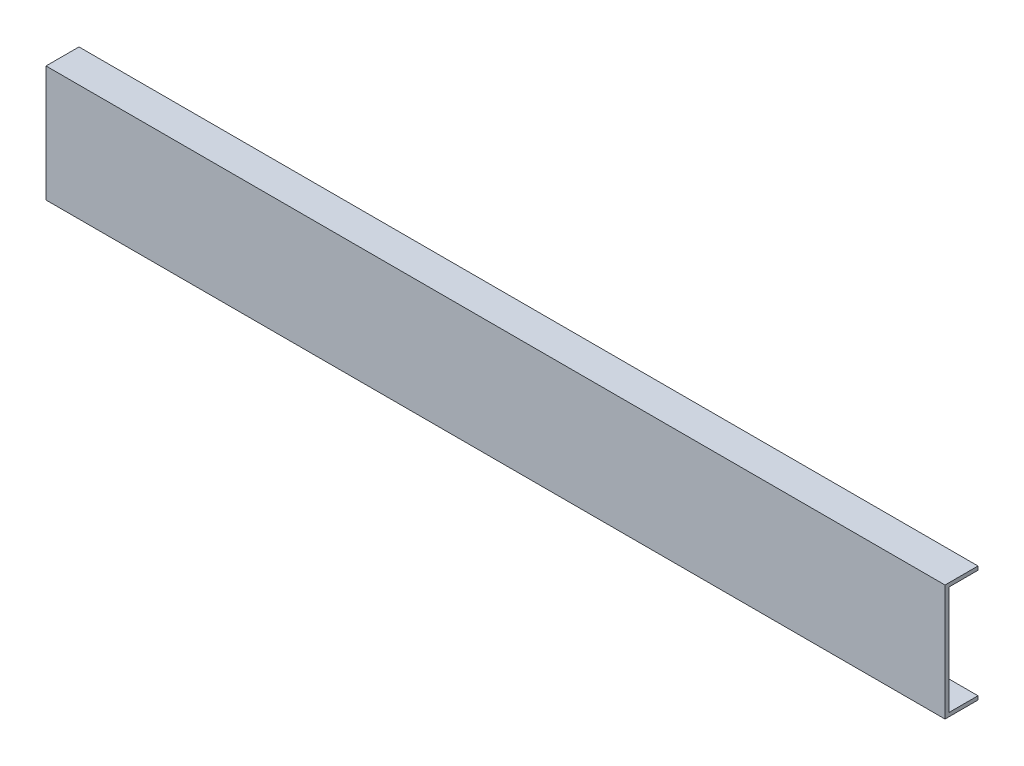
ISO-10303-21;
HEADER;
FILE_DESCRIPTION(('STEP AP214'),'2;1');
FILE_NAME('part.step','',(''),(''),'','','');
FILE_SCHEMA(('AUTOMOTIVE_DESIGN { 1 0 10303 214 1 1 1 1 }'));
ENDSEC;
DATA;
#1=APPLICATION_CONTEXT('core data for automotive mechanical design processes');
#2=APPLICATION_PROTOCOL_DEFINITION('international standard','automotive_design',2000,#1);
#3=PRODUCT_CONTEXT('',#1,'mechanical');
#4=PRODUCT('Part','Part','',(#3));
#5=PRODUCT_RELATED_PRODUCT_CATEGORY('part','',(#4));
#6=PRODUCT_DEFINITION_FORMATION('','',#4);
#7=PRODUCT_DEFINITION_CONTEXT('part definition',#1,'design');
#8=PRODUCT_DEFINITION('design','',#6,#7);
#9=PRODUCT_DEFINITION_SHAPE('','',#8);
#10=(LENGTH_UNIT() NAMED_UNIT(*) SI_UNIT(.MILLI.,.METRE.));
#11=(NAMED_UNIT(*) PLANE_ANGLE_UNIT() SI_UNIT($,.RADIAN.));
#12=(NAMED_UNIT(*) SI_UNIT($,.STERADIAN.) SOLID_ANGLE_UNIT());
#13=UNCERTAINTY_MEASURE_WITH_UNIT(LENGTH_MEASURE(1.E-05),#10,'distance_accuracy_value','');
#14=(GEOMETRIC_REPRESENTATION_CONTEXT(3) GLOBAL_UNCERTAINTY_ASSIGNED_CONTEXT((#13)) GLOBAL_UNIT_ASSIGNED_CONTEXT((#10,
#11,#12)) REPRESENTATION_CONTEXT('',''));
#15=CARTESIAN_POINT('',(0.,0.,0.));
#16=DIRECTION('',(0.,0.,1.));
#17=DIRECTION('',(1.,0.,0.));
#18=AXIS2_PLACEMENT_3D('',#15,#16,#17);
#19=CARTESIAN_POINT('',(0.,0.,0.));
#20=DIRECTION('',(0.,0.,-1.));
#21=DIRECTION('',(-1.,0.,0.));
#22=AXIS2_PLACEMENT_3D('',#19,#20,#21);
#23=PLANE('',#22);
#24=DIRECTION('',(1.,0.,0.));
#25=VECTOR('',#24,1.);
#26=CARTESIAN_POINT('',(0.,2.54,0.));
#27=LINE('',#26,#25);
#28=CARTESIAN_POINT('',(0.,2.54,0.));
#29=VERTEX_POINT('',#28);
#30=CARTESIAN_POINT('',(609.6,2.54,0.));
#31=VERTEX_POINT('',#30);
#32=EDGE_CURVE('E149',#29,#31,#27,.T.);
#33=ORIENTED_EDGE('',*,*,#32,.T.);
#34=DIRECTION('',(0.,1.,0.));
#35=VECTOR('',#34,1.);
#36=CARTESIAN_POINT('',(609.6,0.,0.));
#37=LINE('',#36,#35);
#38=CARTESIAN_POINT('',(609.6,0.,0.));
#39=VERTEX_POINT('',#38);
#40=EDGE_CURVE('E175',#39,#31,#37,.T.);
#41=ORIENTED_EDGE('',*,*,#40,.F.);
#42=DIRECTION('',(1.,0.,0.));
#43=VECTOR('',#42,1.);
#44=CARTESIAN_POINT('',(0.,0.,0.));
#45=LINE('',#44,#43);
#46=CARTESIAN_POINT('',(0.,0.,0.));
#47=VERTEX_POINT('',#46);
#48=EDGE_CURVE('E171',#47,#39,#45,.T.);
#49=ORIENTED_EDGE('',*,*,#48,.F.);
#50=DIRECTION('',(0.,-1.,0.));
#51=VECTOR('',#50,1.);
#52=CARTESIAN_POINT('',(0.,0.,0.));
#53=LINE('',#52,#51);
#54=EDGE_CURVE('E153',#29,#47,#53,.T.);
#55=ORIENTED_EDGE('',*,*,#54,.F.);
#56=EDGE_LOOP('',(#33,#41,#49,#55));
#57=FACE_BOUND('',#56,.T.);
#58=ADVANCED_FACE('F39',(#57),#23,.T.);
#59=CARTESIAN_POINT('',(0.,0.,22.352));
#60=DIRECTION('',(1.,0.,0.));
#61=DIRECTION('',(0.,0.,-1.));
#62=AXIS2_PLACEMENT_3D('',#59,#60,#61);
#63=PLANE('',#62);
#64=DIRECTION('',(0.,-1.,0.));
#65=VECTOR('',#64,1.);
#66=CARTESIAN_POINT('',(0.,76.2,19.812));
#67=LINE('',#66,#65);
#68=CARTESIAN_POINT('',(0.,76.2,19.812));
#69=VERTEX_POINT('',#68);
#70=CARTESIAN_POINT('',(0.,2.54,19.812));
#71=VERTEX_POINT('',#70);
#72=EDGE_CURVE('E125',#69,#71,#67,.T.);
#73=ORIENTED_EDGE('',*,*,#72,.T.);
#74=DIRECTION('',(0.,0.,-1.));
#75=VECTOR('',#74,1.);
#76=CARTESIAN_POINT('',(0.,2.54,0.));
#77=LINE('',#76,#75);
#78=EDGE_CURVE('E131',#71,#29,#77,.T.);
#79=ORIENTED_EDGE('',*,*,#78,.T.);
#80=ORIENTED_EDGE('',*,*,#54,.T.);
#81=DIRECTION('',(0.,0.,-1.));
#82=VECTOR('',#81,1.);
#83=CARTESIAN_POINT('',(0.,0.,22.352));
#84=LINE('',#83,#82);
#85=CARTESIAN_POINT('',(0.,0.,22.352));
#86=VERTEX_POINT('',#85);
#87=EDGE_CURVE('E11',#86,#47,#84,.T.);
#88=ORIENTED_EDGE('',*,*,#87,.F.);
#89=DIRECTION('',(0.,-1.,0.));
#90=VECTOR('',#89,1.);
#91=CARTESIAN_POINT('',(0.,0.,22.352));
#92=LINE('',#91,#90);
#93=CARTESIAN_POINT('',(0.,78.74,22.352));
#94=VERTEX_POINT('',#93);
#95=EDGE_CURVE('E158',#94,#86,#92,.T.);
#96=ORIENTED_EDGE('',*,*,#95,.F.);
#97=DIRECTION('',(0.,0.,-1.));
#98=VECTOR('',#97,1.);
#99=CARTESIAN_POINT('',(0.,78.74,22.352));
#100=LINE('',#99,#98);
#101=CARTESIAN_POINT('',(0.,78.74,0.));
#102=VERTEX_POINT('',#101);
#103=EDGE_CURVE('E168',#94,#102,#100,.T.);
#104=ORIENTED_EDGE('',*,*,#103,.T.);
#105=CARTESIAN_POINT('',(0.,76.2,0.));
#106=VERTEX_POINT('',#105);
#107=EDGE_CURVE('E135',#102,#106,#53,.T.);
#108=ORIENTED_EDGE('',*,*,#107,.T.);
#109=DIRECTION('',(0.,0.,1.));
#110=VECTOR('',#109,1.);
#111=CARTESIAN_POINT('',(0.,76.2,0.));
#112=LINE('',#111,#110);
#113=EDGE_CURVE('E55',#106,#69,#112,.T.);
#114=ORIENTED_EDGE('',*,*,#113,.T.);
#115=EDGE_LOOP('',(#73,#79,#80,#88,#96,#104,#108,#114));
#116=FACE_BOUND('',#115,.T.);
#117=ADVANCED_FACE('F41',(#116),#63,.F.);
#118=CARTESIAN_POINT('',(0.,0.,22.352));
#119=DIRECTION('',(0.,1.,0.));
#120=DIRECTION('',(0.,0.,1.));
#121=AXIS2_PLACEMENT_3D('',#118,#119,#120);
#122=PLANE('',#121);
#123=ORIENTED_EDGE('',*,*,#48,.T.);
#124=DIRECTION('',(0.,0.,-1.));
#125=VECTOR('',#124,1.);
#126=CARTESIAN_POINT('',(609.6,0.,22.352));
#127=LINE('',#126,#125);
#128=CARTESIAN_POINT('',(609.6,0.,22.352));
#129=VERTEX_POINT('',#128);
#130=EDGE_CURVE('E48',#129,#39,#127,.T.);
#131=ORIENTED_EDGE('',*,*,#130,.F.);
#132=DIRECTION('',(1.,0.,0.));
#133=VECTOR('',#132,1.);
#134=CARTESIAN_POINT('',(0.,0.,22.352));
#135=LINE('',#134,#133);
#136=EDGE_CURVE('E92',#86,#129,#135,.T.);
#137=ORIENTED_EDGE('',*,*,#136,.F.);
#138=ORIENTED_EDGE('',*,*,#87,.T.);
#139=EDGE_LOOP('',(#123,#131,#137,#138));
#140=FACE_BOUND('',#139,.T.);
#141=ADVANCED_FACE('F220',(#140),#122,.F.);
#142=CARTESIAN_POINT('',(609.6,0.,22.352));
#143=DIRECTION('',(-1.,0.,0.));
#144=DIRECTION('',(0.,0.,1.));
#145=AXIS2_PLACEMENT_3D('',#142,#143,#144);
#146=PLANE('',#145);
#147=ORIENTED_EDGE('',*,*,#40,.T.);
#148=DIRECTION('',(0.,0.,-1.));
#149=VECTOR('',#148,1.);
#150=CARTESIAN_POINT('',(609.6,2.54,0.));
#151=LINE('',#150,#149);
#152=CARTESIAN_POINT('',(609.6,2.54,19.812));
#153=VERTEX_POINT('',#152);
#154=EDGE_CURVE('E137',#153,#31,#151,.T.);
#155=ORIENTED_EDGE('',*,*,#154,.F.);
#156=DIRECTION('',(0.,-1.,0.));
#157=VECTOR('',#156,1.);
#158=CARTESIAN_POINT('',(609.6,76.2,19.812));
#159=LINE('',#158,#157);
#160=CARTESIAN_POINT('',(609.6,76.2,19.812));
#161=VERTEX_POINT('',#160);
#162=EDGE_CURVE('E140',#161,#153,#159,.T.);
#163=ORIENTED_EDGE('',*,*,#162,.F.);
#164=DIRECTION('',(0.,0.,1.));
#165=VECTOR('',#164,1.);
#166=CARTESIAN_POINT('',(609.6,76.2,0.));
#167=LINE('',#166,#165);
#168=CARTESIAN_POINT('',(609.6,76.2,0.));
#169=VERTEX_POINT('',#168);
#170=EDGE_CURVE('E116',#169,#161,#167,.T.);
#171=ORIENTED_EDGE('',*,*,#170,.F.);
#172=CARTESIAN_POINT('',(609.6,78.74,0.));
#173=VERTEX_POINT('',#172);
#174=EDGE_CURVE('E174',#169,#173,#37,.T.);
#175=ORIENTED_EDGE('',*,*,#174,.T.);
#176=DIRECTION('',(0.,0.,-1.));
#177=VECTOR('',#176,1.);
#178=CARTESIAN_POINT('',(609.6,78.74,22.352));
#179=LINE('',#178,#177);
#180=CARTESIAN_POINT('',(609.6,78.74,22.352));
#181=VERTEX_POINT('',#180);
#182=EDGE_CURVE('E183',#181,#173,#179,.T.);
#183=ORIENTED_EDGE('',*,*,#182,.F.);
#184=DIRECTION('',(0.,1.,0.));
#185=VECTOR('',#184,1.);
#186=CARTESIAN_POINT('',(609.6,0.,22.352));
#187=LINE('',#186,#185);
#188=EDGE_CURVE('E163',#129,#181,#187,.T.);
#189=ORIENTED_EDGE('',*,*,#188,.F.);
#190=ORIENTED_EDGE('',*,*,#130,.T.);
#191=EDGE_LOOP('',(#147,#155,#163,#171,#175,#183,#189,#190));
#192=FACE_BOUND('',#191,.T.);
#193=ADVANCED_FACE('F190',(#192),#146,.F.);
#194=CARTESIAN_POINT('',(0.,78.74,22.352));
#195=DIRECTION('',(0.,-1.,0.));
#196=DIRECTION('',(0.,0.,-1.));
#197=AXIS2_PLACEMENT_3D('',#194,#195,#196);
#198=PLANE('',#197);
#199=DIRECTION('',(-1.,0.,0.));
#200=VECTOR('',#199,1.);
#201=CARTESIAN_POINT('',(0.,78.74,0.));
#202=LINE('',#201,#200);
#203=EDGE_CURVE('E85',#173,#102,#202,.T.);
#204=ORIENTED_EDGE('',*,*,#203,.T.);
#205=ORIENTED_EDGE('',*,*,#103,.F.);
#206=DIRECTION('',(-1.,0.,0.));
#207=VECTOR('',#206,1.);
#208=CARTESIAN_POINT('',(0.,78.74,22.352));
#209=LINE('',#208,#207);
#210=EDGE_CURVE('E64',#181,#94,#209,.T.);
#211=ORIENTED_EDGE('',*,*,#210,.F.);
#212=ORIENTED_EDGE('',*,*,#182,.T.);
#213=EDGE_LOOP('',(#204,#205,#211,#212));
#214=FACE_BOUND('',#213,.T.);
#215=ADVANCED_FACE('F204',(#214),#198,.F.);
#216=CARTESIAN_POINT('',(0.,0.,22.352));
#217=DIRECTION('',(0.,0.,-1.));
#218=DIRECTION('',(-1.,0.,0.));
#219=AXIS2_PLACEMENT_3D('',#216,#217,#218);
#220=PLANE('',#219);
#221=ORIENTED_EDGE('',*,*,#95,.T.);
#222=ORIENTED_EDGE('',*,*,#136,.T.);
#223=ORIENTED_EDGE('',*,*,#188,.T.);
#224=ORIENTED_EDGE('',*,*,#210,.T.);
#225=EDGE_LOOP('',(#221,#222,#223,#224));
#226=FACE_BOUND('',#225,.T.);
#227=ADVANCED_FACE('F207',(#226),#220,.F.);
#228=DIRECTION('',(1.,0.,0.));
#229=VECTOR('',#228,1.);
#230=CARTESIAN_POINT('',(0.,76.2,0.));
#231=LINE('',#230,#229);
#232=EDGE_CURVE('E122',#106,#169,#231,.T.);
#233=ORIENTED_EDGE('',*,*,#232,.F.);
#234=ORIENTED_EDGE('',*,*,#107,.F.);
#235=ORIENTED_EDGE('',*,*,#203,.F.);
#236=ORIENTED_EDGE('',*,*,#174,.F.);
#237=EDGE_LOOP('',(#233,#234,#235,#236));
#238=FACE_BOUND('',#237,.T.);
#239=ADVANCED_FACE('F205',(#238),#23,.T.);
#240=CARTESIAN_POINT('',(0.,2.54,0.));
#241=DIRECTION('',(0.,-1.,0.));
#242=DIRECTION('',(0.,0.,-1.));
#243=AXIS2_PLACEMENT_3D('',#240,#241,#242);
#244=PLANE('',#243);
#245=ORIENTED_EDGE('',*,*,#154,.T.);
#246=ORIENTED_EDGE('',*,*,#32,.F.);
#247=ORIENTED_EDGE('',*,*,#78,.F.);
#248=DIRECTION('',(1.,0.,0.));
#249=VECTOR('',#248,1.);
#250=CARTESIAN_POINT('',(0.,2.54,19.812));
#251=LINE('',#250,#249);
#252=EDGE_CURVE('E121',#71,#153,#251,.T.);
#253=ORIENTED_EDGE('',*,*,#252,.T.);
#254=EDGE_LOOP('',(#245,#246,#247,#253));
#255=FACE_BOUND('',#254,.T.);
#256=ADVANCED_FACE('F197',(#255),#244,.F.);
#257=CARTESIAN_POINT('',(0.,76.2,19.812));
#258=DIRECTION('',(0.,0.,1.));
#259=DIRECTION('',(0.,-1.,0.));
#260=AXIS2_PLACEMENT_3D('',#257,#258,#259);
#261=PLANE('',#260);
#262=ORIENTED_EDGE('',*,*,#162,.T.);
#263=ORIENTED_EDGE('',*,*,#252,.F.);
#264=ORIENTED_EDGE('',*,*,#72,.F.);
#265=DIRECTION('',(1.,0.,0.));
#266=VECTOR('',#265,1.);
#267=CARTESIAN_POINT('',(0.,76.2,19.812));
#268=LINE('',#267,#266);
#269=EDGE_CURVE('E112',#69,#161,#268,.T.);
#270=ORIENTED_EDGE('',*,*,#269,.T.);
#271=EDGE_LOOP('',(#262,#263,#264,#270));
#272=FACE_BOUND('',#271,.T.);
#273=ADVANCED_FACE('F126',(#272),#261,.F.);
#274=CARTESIAN_POINT('',(0.,76.2,0.));
#275=DIRECTION('',(0.,1.,0.));
#276=DIRECTION('',(0.,0.,1.));
#277=AXIS2_PLACEMENT_3D('',#274,#275,#276);
#278=PLANE('',#277);
#279=ORIENTED_EDGE('',*,*,#170,.T.);
#280=ORIENTED_EDGE('',*,*,#269,.F.);
#281=ORIENTED_EDGE('',*,*,#113,.F.);
#282=ORIENTED_EDGE('',*,*,#232,.T.);
#283=EDGE_LOOP('',(#279,#280,#281,#282));
#284=FACE_BOUND('',#283,.T.);
#285=ADVANCED_FACE('F114',(#284),#278,.F.);
#286=CLOSED_SHELL('',(#58,#117,#141,#193,#215,#227,#239,#256,#273,#285));
#287=MANIFOLD_SOLID_BREP('B2',#286);
#288=ADVANCED_BREP_SHAPE_REPRESENTATION('',(#18,#287),#14);
#289=SHAPE_DEFINITION_REPRESENTATION(#9,#288);
ENDSEC;
END-ISO-10303-21;
